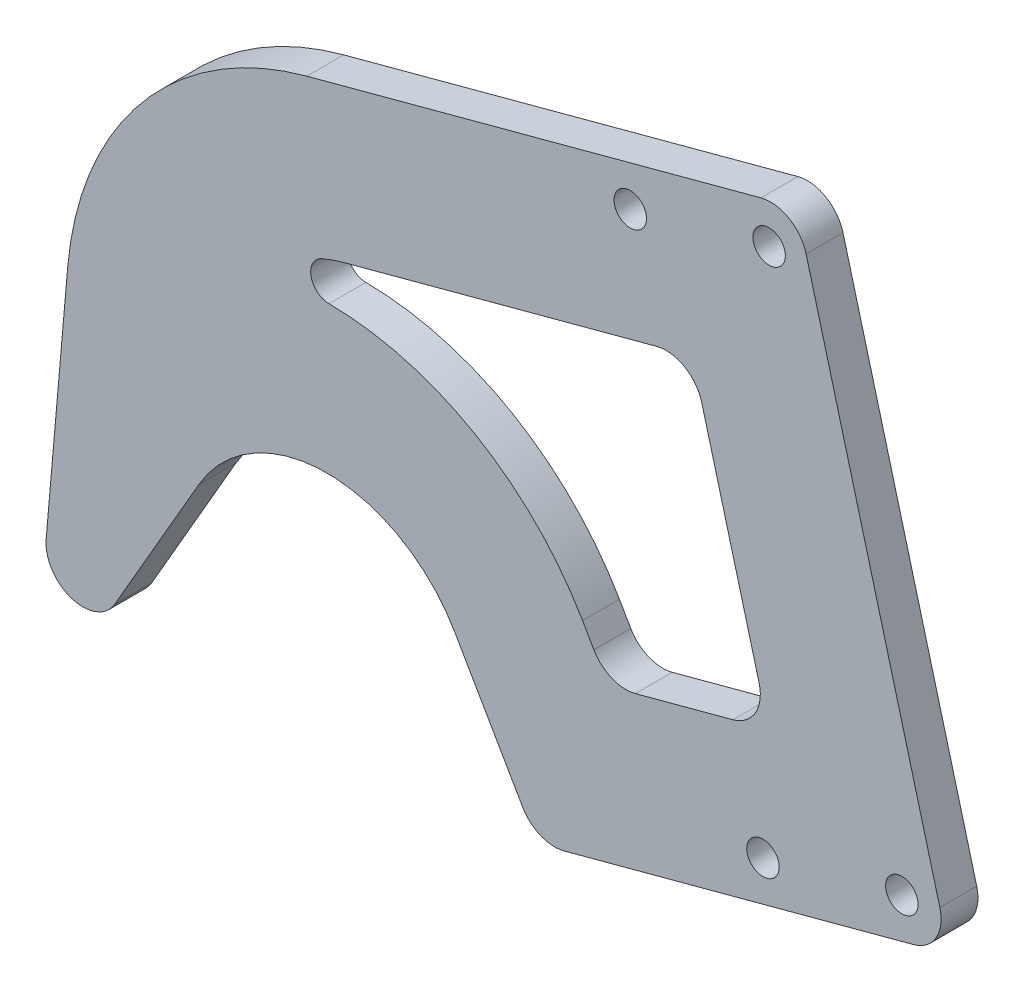
ISO-10303-21;
HEADER;
FILE_DESCRIPTION(('STEP AP214'),'2;1');
FILE_NAME('part.step','',(''),(''),'','','');
FILE_SCHEMA(('AUTOMOTIVE_DESIGN { 1 0 10303 214 1 1 1 1 }'));
ENDSEC;
DATA;
#1=APPLICATION_CONTEXT('core data for automotive mechanical design processes');
#2=APPLICATION_PROTOCOL_DEFINITION('international standard','automotive_design',2000,#1);
#3=PRODUCT_CONTEXT('',#1,'mechanical');
#4=PRODUCT('Part','Part','',(#3));
#5=PRODUCT_RELATED_PRODUCT_CATEGORY('part','',(#4));
#6=PRODUCT_DEFINITION_FORMATION('','',#4);
#7=PRODUCT_DEFINITION_CONTEXT('part definition',#1,'design');
#8=PRODUCT_DEFINITION('design','',#6,#7);
#9=PRODUCT_DEFINITION_SHAPE('','',#8);
#10=(LENGTH_UNIT() NAMED_UNIT(*) SI_UNIT(.MILLI.,.METRE.));
#11=(NAMED_UNIT(*) PLANE_ANGLE_UNIT() SI_UNIT($,.RADIAN.));
#12=(NAMED_UNIT(*) SI_UNIT($,.STERADIAN.) SOLID_ANGLE_UNIT());
#13=UNCERTAINTY_MEASURE_WITH_UNIT(LENGTH_MEASURE(1.E-05),#10,'distance_accuracy_value','');
#14=(GEOMETRIC_REPRESENTATION_CONTEXT(3) GLOBAL_UNCERTAINTY_ASSIGNED_CONTEXT((#13)) GLOBAL_UNIT_ASSIGNED_CONTEXT((#10,
#11,#12)) REPRESENTATION_CONTEXT('',''));
#15=CARTESIAN_POINT('',(0.,0.,0.));
#16=DIRECTION('',(0.,0.,1.));
#17=DIRECTION('',(1.,0.,0.));
#18=AXIS2_PLACEMENT_3D('',#15,#16,#17);
#19=CARTESIAN_POINT('',(0.,17.3058666666666,-1.5875));
#20=DIRECTION('',(0.,0.,1.));
#21=DIRECTION('',(-1.,0.,0.));
#22=AXIS2_PLACEMENT_3D('',#19,#20,#21);
#23=CYLINDRICAL_SURFACE('',#22,12.7);
#24=CARTESIAN_POINT('',(0.,17.3058666666666,1.5875));
#25=DIRECTION('',(0.,0.,-1.));
#26=DIRECTION('',(-1.,0.,0.));
#27=AXIS2_PLACEMENT_3D('',#24,#25,#26);
#28=CIRCLE('',#27,12.7);
#29=CARTESIAN_POINT('',(-10.9985226280624,23.6558666666666,1.5875));
#30=VERTEX_POINT('',#29);
#31=CARTESIAN_POINT('',(10.9985226280624,23.6558666666666,1.5875));
#32=VERTEX_POINT('',#31);
#33=EDGE_CURVE('E282',#30,#32,#28,.T.);
#34=ORIENTED_EDGE('',*,*,#33,.F.);
#35=DIRECTION('',(0.,0.,1.));
#36=VECTOR('',#35,1.);
#37=CARTESIAN_POINT('',(-10.9985226280624,23.6558666666666,-1.5875));
#38=LINE('',#37,#36);
#39=CARTESIAN_POINT('',(-10.9985226280624,23.6558666666666,-1.5875));
#40=VERTEX_POINT('',#39);
#41=EDGE_CURVE('E321',#40,#30,#38,.T.);
#42=ORIENTED_EDGE('',*,*,#41,.F.);
#43=CARTESIAN_POINT('',(0.,17.3058666666666,-1.5875));
#44=DIRECTION('',(0.,0.,-1.));
#45=DIRECTION('',(-1.,0.,0.));
#46=AXIS2_PLACEMENT_3D('',#43,#44,#45);
#47=CIRCLE('',#46,12.7);
#48=CARTESIAN_POINT('',(10.9985226280624,23.6558666666666,-1.5875));
#49=VERTEX_POINT('',#48);
#50=EDGE_CURVE('E284',#40,#49,#47,.T.);
#51=ORIENTED_EDGE('',*,*,#50,.T.);
#52=DIRECTION('',(0.,0.,1.));
#53=VECTOR('',#52,1.);
#54=CARTESIAN_POINT('',(10.9985226280624,23.6558666666666,-1.5875));
#55=LINE('',#54,#53);
#56=EDGE_CURVE('E379',#49,#32,#55,.T.);
#57=ORIENTED_EDGE('',*,*,#56,.T.);
#58=EDGE_LOOP('',(#34,#42,#51,#57));
#59=FACE_BOUND('',#58,.T.);
#60=ADVANCED_FACE('F49',(#59),#23,.F.);
#61=CARTESIAN_POINT('',(10.9985226280624,23.6558666666666,-1.5875));
#62=DIRECTION('',(0.866025403784439,0.499999999999999,0.));
#63=DIRECTION('',(-0.499999999999999,0.86602540378444,0.));
#64=AXIS2_PLACEMENT_3D('',#61,#62,#63);
#65=PLANE('',#64);
#66=DIRECTION('',(0.499999999999999,-0.866025403784439,0.));
#67=VECTOR('',#66,1.);
#68=CARTESIAN_POINT('',(10.9985226280624,23.6558666666666,1.5875));
#69=LINE('',#68,#67);
#70=CARTESIAN_POINT('',(16.8477998671147,13.5246213010718,1.5875));
#71=VERTEX_POINT('',#70);
#72=EDGE_CURVE('E325',#32,#71,#69,.T.);
#73=ORIENTED_EDGE('',*,*,#72,.F.);
#74=ORIENTED_EDGE('',*,*,#56,.F.);
#75=DIRECTION('',(0.499999999999999,-0.866025403784439,0.));
#76=VECTOR('',#75,1.);
#77=CARTESIAN_POINT('',(10.9985226280624,23.6558666666666,-1.5875));
#78=LINE('',#77,#76);
#79=CARTESIAN_POINT('',(16.8477998671147,13.5246213010718,-1.5875));
#80=VERTEX_POINT('',#79);
#81=EDGE_CURVE('E288',#49,#80,#78,.T.);
#82=ORIENTED_EDGE('',*,*,#81,.T.);
#83=DIRECTION('',(0.,0.,1.));
#84=VECTOR('',#83,1.);
#85=CARTESIAN_POINT('',(16.8477998671147,13.5246213010718,-1.5875));
#86=LINE('',#85,#84);
#87=EDGE_CURVE('E376',#80,#71,#86,.T.);
#88=ORIENTED_EDGE('',*,*,#87,.T.);
#89=EDGE_LOOP('',(#73,#74,#82,#88));
#90=FACE_BOUND('',#89,.T.);
#91=ADVANCED_FACE('F485',(#90),#65,.F.);
#92=CARTESIAN_POINT('',(19.5974305241302,15.1121213010718,-1.5875));
#93=DIRECTION('',(0.,0.,1.));
#94=DIRECTION('',(-1.,0.,0.));
#95=AXIS2_PLACEMENT_3D('',#92,#93,#94);
#96=CYLINDRICAL_SURFACE('',#95,3.175);
#97=CARTESIAN_POINT('',(19.5974305241302,15.1121213010718,1.5875));
#98=DIRECTION('',(0.,0.,1.));
#99=DIRECTION('',(1.,0.,0.));
#100=AXIS2_PLACEMENT_3D('',#97,#98,#99);
#101=CIRCLE('',#100,3.175);
#102=CARTESIAN_POINT('',(20.4191809923307,12.045306802604,1.5875));
#103=VERTEX_POINT('',#102);
#104=EDGE_CURVE('E329',#71,#103,#101,.T.);
#105=ORIENTED_EDGE('',*,*,#104,.F.);
#106=ORIENTED_EDGE('',*,*,#87,.F.);
#107=CARTESIAN_POINT('',(19.5974305241302,15.1121213010718,-1.5875));
#108=DIRECTION('',(0.,0.,1.));
#109=DIRECTION('',(1.,0.,0.));
#110=AXIS2_PLACEMENT_3D('',#107,#108,#109);
#111=CIRCLE('',#110,3.175);
#112=CARTESIAN_POINT('',(20.4191809923307,12.045306802604,-1.5875));
#113=VERTEX_POINT('',#112);
#114=EDGE_CURVE('E293',#80,#113,#111,.T.);
#115=ORIENTED_EDGE('',*,*,#114,.T.);
#116=DIRECTION('',(0.,0.,1.));
#117=VECTOR('',#116,1.);
#118=CARTESIAN_POINT('',(20.4191809923307,12.045306802604,-1.5875));
#119=LINE('',#118,#117);
#120=EDGE_CURVE('E373',#113,#103,#119,.T.);
#121=ORIENTED_EDGE('',*,*,#120,.T.);
#122=EDGE_LOOP('',(#105,#106,#115,#121));
#123=FACE_BOUND('',#122,.T.);
#124=ADVANCED_FACE('F491',(#123),#96,.T.);
#125=CARTESIAN_POINT('',(20.4191809923308,12.045306802604,-1.5875));
#126=DIRECTION('',(-0.258819045102522,0.965925826289068,0.));
#127=DIRECTION('',(-0.965925826289068,-0.258819045102522,0.));
#128=AXIS2_PLACEMENT_3D('',#125,#126,#127);
#129=PLANE('',#128);
#130=DIRECTION('',(0.965925826289068,0.258819045102522,0.));
#131=VECTOR('',#130,1.);
#132=CARTESIAN_POINT('',(20.4191809923308,12.045306802604,1.5875));
#133=LINE('',#132,#131);
#134=CARTESIAN_POINT('',(50.4923455375514,20.1033869563442,1.5875));
#135=VERTEX_POINT('',#134);
#136=EDGE_CURVE('E332',#103,#135,#133,.T.);
#137=ORIENTED_EDGE('',*,*,#136,.F.);
#138=ORIENTED_EDGE('',*,*,#120,.F.);
#139=DIRECTION('',(0.965925826289068,0.258819045102522,0.));
#140=VECTOR('',#139,1.);
#141=CARTESIAN_POINT('',(20.4191809923308,12.045306802604,-1.5875));
#142=LINE('',#141,#140);
#143=CARTESIAN_POINT('',(50.4923455375514,20.1033869563442,-1.5875));
#144=VERTEX_POINT('',#143);
#145=EDGE_CURVE('E296',#113,#144,#142,.T.);
#146=ORIENTED_EDGE('',*,*,#145,.T.);
#147=DIRECTION('',(0.,0.,1.));
#148=VECTOR('',#147,1.);
#149=CARTESIAN_POINT('',(50.4923455375514,20.1033869563442,-1.5875));
#150=LINE('',#149,#148);
#151=EDGE_CURVE('E395',#135,#144,#150,.F.);
#152=ORIENTED_EDGE('',*,*,#151,.F.);
#153=EDGE_LOOP('',(#137,#138,#146,#152));
#154=FACE_BOUND('',#153,.T.);
#155=ADVANCED_FACE('F709',(#154),#129,.F.);
#156=CARTESIAN_POINT('',(53.5591600360192,20.9251374245447,-1.5875));
#157=DIRECTION('',(-0.965925826289068,-0.258819045102521,0.));
#158=DIRECTION('',(0.258819045102521,-0.965925826289068,0.));
#159=AXIS2_PLACEMENT_3D('',#156,#157,#158);
#160=PLANE('',#159);
#161=DIRECTION('',(-0.258819045102521,0.965925826289068,0.));
#162=VECTOR('',#161,1.);
#163=CARTESIAN_POINT('',(53.5591600360192,20.9251374245447,-1.5875));
#164=LINE('',#163,#162);
#165=CARTESIAN_POINT('',(52.7374095678187,23.9919519230125,-1.5875));
#166=VERTEX_POINT('',#165);
#167=CARTESIAN_POINT('',(41.2329030130117,66.9273549015616,-1.5875));
#168=VERTEX_POINT('',#167);
#169=EDGE_CURVE('E299',#166,#168,#164,.T.);
#170=ORIENTED_EDGE('',*,*,#169,.T.);
#171=DIRECTION('',(0.,0.,1.));
#172=VECTOR('',#171,1.);
#173=CARTESIAN_POINT('',(41.2329030130116,66.9273549015616,-1.5875));
#174=LINE('',#173,#172);
#175=CARTESIAN_POINT('',(41.2329030130117,66.9273549015616,1.5875));
#176=VERTEX_POINT('',#175);
#177=EDGE_CURVE('E383',#176,#168,#174,.F.);
#178=ORIENTED_EDGE('',*,*,#177,.F.);
#179=DIRECTION('',(-0.258819045102521,0.965925826289068,0.));
#180=VECTOR('',#179,1.);
#181=CARTESIAN_POINT('',(53.5591600360192,20.9251374245447,1.5875));
#182=LINE('',#181,#180);
#183=CARTESIAN_POINT('',(52.7374095678187,23.9919519230125,1.5875));
#184=VERTEX_POINT('',#183);
#185=EDGE_CURVE('E335',#184,#176,#182,.T.);
#186=ORIENTED_EDGE('',*,*,#185,.F.);
#187=DIRECTION('',(0.,0.,1.));
#188=VECTOR('',#187,1.);
#189=CARTESIAN_POINT('',(52.7374095678187,23.9919519230125,-1.5875));
#190=LINE('',#189,#188);
#191=EDGE_CURVE('E387',#166,#184,#190,.T.);
#192=ORIENTED_EDGE('',*,*,#191,.F.);
#193=EDGE_LOOP('',(#170,#178,#186,#192));
#194=FACE_BOUND('',#193,.T.);
#195=ADVANCED_FACE('F698',(#194),#160,.F.);
#196=CARTESIAN_POINT('',(-1.72065451339829,58.7049857231183,-1.5875));
#197=DIRECTION('',(0.258819045102522,-0.965925826289068,0.));
#198=DIRECTION('',(0.965925826289068,0.258819045102522,0.));
#199=AXIS2_PLACEMENT_3D('',#196,#197,#198);
#200=PLANE('',#199);
#201=DIRECTION('',(-0.965925826289068,-0.258819045102522,0.));
#202=VECTOR('',#201,1.);
#203=CARTESIAN_POINT('',(-1.72065451339829,58.7049857231183,-1.5875));
#204=LINE('',#203,#202);
#205=CARTESIAN_POINT('',(37.3443380463433,69.1724189318289,-1.5875));
#206=VERTEX_POINT('',#205);
#207=CARTESIAN_POINT('',(-1.72065451339829,58.7049857231183,-1.5875));
#208=VERTEX_POINT('',#207);
#209=EDGE_CURVE('E303',#206,#208,#204,.T.);
#210=ORIENTED_EDGE('',*,*,#209,.T.);
#211=DIRECTION('',(0.,0.,1.));
#212=VECTOR('',#211,1.);
#213=CARTESIAN_POINT('',(-1.72065451339829,58.7049857231183,-1.5875));
#214=LINE('',#213,#212);
#215=CARTESIAN_POINT('',(-1.72065451339829,58.7049857231183,1.5875));
#216=VERTEX_POINT('',#215);
#217=EDGE_CURVE('E369',#208,#216,#214,.T.);
#218=ORIENTED_EDGE('',*,*,#217,.T.);
#219=DIRECTION('',(-0.965925826289068,-0.258819045102522,0.));
#220=VECTOR('',#219,1.);
#221=CARTESIAN_POINT('',(-1.72065451339829,58.7049857231183,1.5875));
#222=LINE('',#221,#220);
#223=CARTESIAN_POINT('',(37.3443380463433,69.1724189318289,1.5875));
#224=VERTEX_POINT('',#223);
#225=EDGE_CURVE('E339',#224,#216,#222,.T.);
#226=ORIENTED_EDGE('',*,*,#225,.F.);
#227=DIRECTION('',(0.,0.,1.));
#228=VECTOR('',#227,1.);
#229=CARTESIAN_POINT('',(37.3443380463433,69.1724189318289,-1.5875));
#230=LINE('',#229,#228);
#231=EDGE_CURVE('E403',#206,#224,#230,.T.);
#232=ORIENTED_EDGE('',*,*,#231,.F.);
#233=EDGE_LOOP('',(#210,#218,#226,#232));
#234=FACE_BOUND('',#233,.T.);
#235=ADVANCED_FACE('F688',(#234),#200,.F.);
#236=CARTESIAN_POINT('',(5.50191214310372,31.75,-1.5875));
#237=DIRECTION('',(0.,0.,1.));
#238=DIRECTION('',(-1.,0.,0.));
#239=AXIS2_PLACEMENT_3D('',#236,#237,#238);
#240=CYLINDRICAL_SURFACE('',#239,27.9058546624382);
#241=CARTESIAN_POINT('',(5.50191214310372,31.75,1.5875));
#242=DIRECTION('',(0.,0.,1.));
#243=DIRECTION('',(1.,0.,0.));
#244=AXIS2_PLACEMENT_3D('',#241,#242,#243);
#245=CIRCLE('',#244,27.9058546624382);
#246=CARTESIAN_POINT('',(-22.297752317336,34.1821554901132,1.5875));
#247=VERTEX_POINT('',#246);
#248=EDGE_CURVE('E343',#216,#247,#245,.T.);
#249=ORIENTED_EDGE('',*,*,#248,.F.);
#250=ORIENTED_EDGE('',*,*,#217,.F.);
#251=CARTESIAN_POINT('',(5.50191214310372,31.75,-1.5875));
#252=DIRECTION('',(0.,0.,1.));
#253=DIRECTION('',(1.,0.,0.));
#254=AXIS2_PLACEMENT_3D('',#251,#252,#253);
#255=CIRCLE('',#254,27.9058546624382);
#256=CARTESIAN_POINT('',(-22.297752317336,34.1821554901132,-1.5875));
#257=VERTEX_POINT('',#256);
#258=EDGE_CURVE('E307',#208,#257,#255,.T.);
#259=ORIENTED_EDGE('',*,*,#258,.T.);
#260=DIRECTION('',(0.,0.,1.));
#261=VECTOR('',#260,1.);
#262=CARTESIAN_POINT('',(-22.297752317336,34.1821554901132,-1.5875));
#263=LINE('',#262,#261);
#264=EDGE_CURVE('E365',#257,#247,#263,.T.);
#265=ORIENTED_EDGE('',*,*,#264,.T.);
#266=EDGE_LOOP('',(#249,#250,#259,#265));
#267=FACE_BOUND('',#266,.T.);
#268=ADVANCED_FACE('F678',(#267),#240,.T.);
#269=CARTESIAN_POINT('',(-24.1529875730634,12.9767194832238,-1.5875));
#270=DIRECTION('',(0.996194698091745,-0.0871557427476642,0.));
#271=DIRECTION('',(0.0871557427476642,0.996194698091745,0.));
#272=AXIS2_PLACEMENT_3D('',#269,#270,#271);
#273=PLANE('',#272);
#274=DIRECTION('',(-0.0871557427476642,-0.996194698091745,0.));
#275=VECTOR('',#274,1.);
#276=CARTESIAN_POINT('',(-24.1529875730634,12.9767194832238,1.5875));
#277=LINE('',#276,#275);
#278=CARTESIAN_POINT('',(-24.1529875730634,12.9767194832238,1.5875));
#279=VERTEX_POINT('',#278);
#280=EDGE_CURVE('E347',#247,#279,#277,.T.);
#281=ORIENTED_EDGE('',*,*,#280,.F.);
#282=ORIENTED_EDGE('',*,*,#264,.F.);
#283=DIRECTION('',(-0.0871557427476642,-0.996194698091745,0.));
#284=VECTOR('',#283,1.);
#285=CARTESIAN_POINT('',(-24.1529875730634,12.9767194832238,-1.5875));
#286=LINE('',#285,#284);
#287=CARTESIAN_POINT('',(-24.1529875730634,12.9767194832238,-1.5875));
#288=VERTEX_POINT('',#287);
#289=EDGE_CURVE('E311',#257,#288,#286,.T.);
#290=ORIENTED_EDGE('',*,*,#289,.T.);
#291=DIRECTION('',(0.,0.,1.));
#292=VECTOR('',#291,1.);
#293=CARTESIAN_POINT('',(-24.1529875730634,12.9767194832238,-1.5875));
#294=LINE('',#293,#292);
#295=EDGE_CURVE('E362',#288,#279,#294,.T.);
#296=ORIENTED_EDGE('',*,*,#295,.T.);
#297=EDGE_LOOP('',(#281,#282,#290,#296));
#298=FACE_BOUND('',#297,.T.);
#299=ADVANCED_FACE('F668',(#298),#273,.F.);
#300=CARTESIAN_POINT('',(-20.9900694066221,12.7,-1.5875));
#301=DIRECTION('',(0.,0.,1.));
#302=DIRECTION('',(-1.,0.,0.));
#303=AXIS2_PLACEMENT_3D('',#300,#301,#302);
#304=CYLINDRICAL_SURFACE('',#303,3.175);
#305=CARTESIAN_POINT('',(-20.9900694066221,12.7,1.5875));
#306=DIRECTION('',(0.,0.,1.));
#307=DIRECTION('',(1.,0.,0.));
#308=AXIS2_PLACEMENT_3D('',#305,#306,#307);
#309=CIRCLE('',#308,3.175);
#310=CARTESIAN_POINT('',(-18.2404387496065,11.1125,1.5875));
#311=VERTEX_POINT('',#310);
#312=EDGE_CURVE('E351',#279,#311,#309,.T.);
#313=ORIENTED_EDGE('',*,*,#312,.F.);
#314=ORIENTED_EDGE('',*,*,#295,.F.);
#315=CARTESIAN_POINT('',(-20.9900694066221,12.7,-1.5875));
#316=DIRECTION('',(0.,0.,1.));
#317=DIRECTION('',(1.,0.,0.));
#318=AXIS2_PLACEMENT_3D('',#315,#316,#317);
#319=CIRCLE('',#318,3.175);
#320=CARTESIAN_POINT('',(-18.2404387496065,11.1125,-1.5875));
#321=VERTEX_POINT('',#320);
#322=EDGE_CURVE('E315',#288,#321,#319,.T.);
#323=ORIENTED_EDGE('',*,*,#322,.T.);
#324=DIRECTION('',(0.,0.,1.));
#325=VECTOR('',#324,1.);
#326=CARTESIAN_POINT('',(-18.2404387496065,11.1125,-1.5875));
#327=LINE('',#326,#325);
#328=EDGE_CURVE('E359',#321,#311,#327,.T.);
#329=ORIENTED_EDGE('',*,*,#328,.T.);
#330=EDGE_LOOP('',(#313,#314,#323,#329));
#331=FACE_BOUND('',#330,.T.);
#332=ADVANCED_FACE('F658',(#331),#304,.T.);
#333=CARTESIAN_POINT('',(-10.9985226280624,23.6558666666666,-1.5875));
#334=DIRECTION('',(-0.866025403784439,0.5,0.));
#335=DIRECTION('',(-0.5,-0.866025403784439,0.));
#336=AXIS2_PLACEMENT_3D('',#333,#334,#335);
#337=PLANE('',#336);
#338=DIRECTION('',(0.5,0.866025403784439,0.));
#339=VECTOR('',#338,1.);
#340=CARTESIAN_POINT('',(-10.9985226280624,23.6558666666666,1.5875));
#341=LINE('',#340,#339);
#342=EDGE_CURVE('E289',#311,#30,#341,.T.);
#343=ORIENTED_EDGE('',*,*,#342,.F.);
#344=ORIENTED_EDGE('',*,*,#328,.F.);
#345=DIRECTION('',(0.5,0.866025403784439,0.));
#346=VECTOR('',#345,1.);
#347=CARTESIAN_POINT('',(-10.9985226280624,23.6558666666666,-1.5875));
#348=LINE('',#347,#346);
#349=EDGE_CURVE('E318',#321,#40,#348,.T.);
#350=ORIENTED_EDGE('',*,*,#349,.T.);
#351=ORIENTED_EDGE('',*,*,#41,.T.);
#352=EDGE_LOOP('',(#343,#344,#350,#351));
#353=FACE_BOUND('',#352,.T.);
#354=ADVANCED_FACE('F648',(#353),#337,.F.);
#355=CARTESIAN_POINT('',(0.,17.3058666666666,-1.5875));
#356=DIRECTION('',(0.,0.,1.));
#357=DIRECTION('',(-1.,0.,0.));
#358=AXIS2_PLACEMENT_3D('',#355,#356,#357);
#359=PLANE('',#358);
#360=CARTESIAN_POINT('',(37.5200804050536,20.0854049602765,-1.5875));
#361=DIRECTION('',(0.,0.,-1.));
#362=DIRECTION('',(-1.,0.,0.));
#363=AXIS2_PLACEMENT_3D('',#360,#361,#362);
#364=CIRCLE('',#363,1.39699999999982);
#365=CARTESIAN_POINT('',(36.1230804050538,20.0854049602765,-1.5875));
#366=VERTEX_POINT('',#365);
#367=EDGE_CURVE('E267',#366,#366,#364,.T.);
#368=ORIENTED_EDGE('',*,*,#367,.F.);
#369=EDGE_LOOP('',(#368));
#370=FACE_BOUND('',#369,.T.);
#371=CARTESIAN_POINT('',(26.1010358989393,62.701859230985,-1.5875));
#372=DIRECTION('',(0.,0.,-1.));
#373=DIRECTION('',(-1.,0.,0.));
#374=AXIS2_PLACEMENT_3D('',#371,#372,#373);
#375=CIRCLE('',#374,1.39699999999982);
#376=CARTESIAN_POINT('',(24.7040358989395,62.701859230985,-1.5875));
#377=VERTEX_POINT('',#376);
#378=EDGE_CURVE('E760',#377,#377,#375,.T.);
#379=ORIENTED_EDGE('',*,*,#378,.F.);
#380=EDGE_LOOP('',(#379));
#381=FACE_BOUND('',#380,.T.);
#382=CARTESIAN_POINT('',(38.0493451849699,65.9033990550941,-1.5875));
#383=DIRECTION('',(0.,0.,-1.));
#384=DIRECTION('',(-1.,0.,0.));
#385=AXIS2_PLACEMENT_3D('',#382,#383,#384);
#386=CIRCLE('',#385,1.39699999999981);
#387=CARTESIAN_POINT('',(36.6523451849701,65.9033990550941,-1.5875));
#388=VERTEX_POINT('',#387);
#389=EDGE_CURVE('E764',#388,#388,#386,.T.);
#390=ORIENTED_EDGE('',*,*,#389,.F.);
#391=EDGE_LOOP('',(#390));
#392=FACE_BOUND('',#391,.T.);
#393=CARTESIAN_POINT('',(49.4683896910841,23.2869447843857,-1.5875));
#394=DIRECTION('',(0.,0.,-1.));
#395=DIRECTION('',(-1.,0.,0.));
#396=AXIS2_PLACEMENT_3D('',#393,#394,#395);
#397=CIRCLE('',#396,1.39699999999982);
#398=CARTESIAN_POINT('',(48.0713896910843,23.2869447843857,-1.5875));
#399=VERTEX_POINT('',#398);
#400=EDGE_CURVE('E767',#399,#399,#397,.T.);
#401=ORIENTED_EDGE('',*,*,#400,.F.);
#402=EDGE_LOOP('',(#401));
#403=FACE_BOUND('',#402,.T.);
#404=CARTESIAN_POINT('',(5.50191214310372,31.75,-1.5875));
#405=DIRECTION('',(0.,0.,1.));
#406=DIRECTION('',(1.,0.,0.));
#407=AXIS2_PLACEMENT_3D('',#404,#405,#406);
#408=CIRCLE('',#407,15.2058546624382);
#409=CARTESIAN_POINT('',(1.56634735940374,46.4377277292471,-1.5875));
#410=VERTEX_POINT('',#409);
#411=CARTESIAN_POINT('',(-0.421343194027553,45.7547514160852,-1.5875));
#412=VERTEX_POINT('',#411);
#413=EDGE_CURVE('E224',#410,#412,#408,.T.);
#414=ORIENTED_EDGE('',*,*,#413,.T.);
#415=CARTESIAN_POINT('',(0.197048080678221,44.2926472879986,-1.5875));
#416=DIRECTION('',(0.,0.,-1.));
#417=DIRECTION('',(-1.,0.,0.));
#418=AXIS2_PLACEMENT_3D('',#415,#416,#417);
#419=CIRCLE('',#418,1.5875);
#420=CARTESIAN_POINT('',(0.185457017108914,42.7051896043908,-1.5875));
#421=VERTEX_POINT('',#420);
#422=EDGE_CURVE('E58',#421,#412,#419,.T.);
#423=ORIENTED_EDGE('',*,*,#422,.F.);
#424=CARTESIAN_POINT('',(0.,17.3058666666666,-1.5875));
#425=DIRECTION('',(0.,0.,-1.));
#426=DIRECTION('',(1.,0.,0.));
#427=AXIS2_PLACEMENT_3D('',#424,#425,#426);
#428=CIRCLE('',#427,25.4);
#429=CARTESIAN_POINT('',(21.9970452561247,30.0058666666666,-1.5875));
#430=VERTEX_POINT('',#429);
#431=EDGE_CURVE('E269',#421,#430,#428,.T.);
#432=ORIENTED_EDGE('',*,*,#431,.T.);
#433=DIRECTION('',(0.499999999999998,-0.866025403784439,0.));
#434=VECTOR('',#433,1.);
#435=CARTESIAN_POINT('',(21.9970452561247,30.0058666666666,-1.5875));
#436=LINE('',#435,#434);
#437=CARTESIAN_POINT('',(22.9737961215106,28.3140845414814,-1.5875));
#438=VERTEX_POINT('',#437);
#439=EDGE_CURVE('E273',#430,#438,#436,.T.);
#440=ORIENTED_EDGE('',*,*,#439,.T.);
#441=CARTESIAN_POINT('',(25.7234267785262,29.9015845414814,-1.5875));
#442=DIRECTION('',(0.,0.,-1.));
#443=DIRECTION('',(-1.,0.,0.));
#444=AXIS2_PLACEMENT_3D('',#441,#442,#443);
#445=CIRCLE('',#444,3.175);
#446=CARTESIAN_POINT('',(26.5451772467267,26.8347700430136,-1.5875));
#447=VERTEX_POINT('',#446);
#448=EDGE_CURVE('E435',#447,#438,#445,.T.);
#449=ORIENTED_EDGE('',*,*,#448,.F.);
#450=DIRECTION('',(0.965925826289068,0.258819045102521,0.));
#451=VECTOR('',#450,1.);
#452=CARTESIAN_POINT('',(24.1919277149272,26.204218731379,-1.5875));
#453=LINE('',#452,#451);
#454=CARTESIAN_POINT('',(34.9380856708783,29.0836430774133,-1.5875));
#455=VERTEX_POINT('',#454);
#456=EDGE_CURVE('E276',#447,#455,#453,.T.);
#457=ORIENTED_EDGE('',*,*,#456,.T.);
#458=CARTESIAN_POINT('',(34.1163352026777,32.1504575758811,-1.5875));
#459=DIRECTION('',(0.,0.,-1.));
#460=DIRECTION('',(-1.,0.,0.));
#461=AXIS2_PLACEMENT_3D('',#458,#459,#460);
#462=CIRCLE('',#461,3.175);
#463=CARTESIAN_POINT('',(37.1831497011455,32.9722080440816,-1.5875));
#464=VERTEX_POINT('',#463);
#465=EDGE_CURVE('E428',#464,#455,#462,.T.);
#466=ORIENTED_EDGE('',*,*,#465,.F.);
#467=DIRECTION('',(-0.258819045102521,0.965925826289068,0.));
#468=VECTOR('',#467,1.);
#469=CARTESIAN_POINT('',(38.004900169346,29.9053935456138,-1.5875));
#470=LINE('',#469,#468);
#471=CARTESIAN_POINT('',(32.2526468919425,51.3730950348884,-1.5875));
#472=VERTEX_POINT('',#471);
#473=EDGE_CURVE('E240',#464,#472,#470,.T.);
#474=ORIENTED_EDGE('',*,*,#473,.T.);
#475=CARTESIAN_POINT('',(29.1858323934747,50.5513445666879,-1.5875));
#476=DIRECTION('',(0.,0.,-1.));
#477=DIRECTION('',(-1.,0.,0.));
#478=AXIS2_PLACEMENT_3D('',#475,#476,#477);
#479=CIRCLE('',#478,3.175);
#480=CARTESIAN_POINT('',(28.3640819252742,53.6181590651557,-1.5875));
#481=VERTEX_POINT('',#480);
#482=EDGE_CURVE('E421',#481,#472,#479,.T.);
#483=ORIENTED_EDGE('',*,*,#482,.F.);
#484=DIRECTION('',(-0.965925826289068,-0.258819045102522,0.));
#485=VECTOR('',#484,1.);
#486=CARTESIAN_POINT('',(31.430896423742,54.4399095333562,-1.5875));
#487=LINE('',#486,#485);
#488=EDGE_CURVE('E264',#481,#410,#487,.T.);
#489=ORIENTED_EDGE('',*,*,#488,.T.);
#490=EDGE_LOOP('',(#414,#423,#432,#440,#449,#457,#466,#474,#483,#489));
#491=FACE_BOUND('',#490,.T.);
#492=ORIENTED_EDGE('',*,*,#145,.F.);
#493=ORIENTED_EDGE('',*,*,#114,.F.);
#494=ORIENTED_EDGE('',*,*,#81,.F.);
#495=ORIENTED_EDGE('',*,*,#50,.F.);
#496=ORIENTED_EDGE('',*,*,#349,.F.);
#497=ORIENTED_EDGE('',*,*,#322,.F.);
#498=ORIENTED_EDGE('',*,*,#289,.F.);
#499=ORIENTED_EDGE('',*,*,#258,.F.);
#500=ORIENTED_EDGE('',*,*,#209,.F.);
#501=CARTESIAN_POINT('',(38.1660885145438,66.1056044333611,-1.5875));
#502=DIRECTION('',(0.,0.,-1.));
#503=DIRECTION('',(-1.,0.,0.));
#504=AXIS2_PLACEMENT_3D('',#501,#502,#503);
#505=CIRCLE('',#504,3.175);
#506=EDGE_CURVE('E398',#168,#206,#505,.F.);
#507=ORIENTED_EDGE('',*,*,#506,.F.);
#508=ORIENTED_EDGE('',*,*,#169,.F.);
#509=CARTESIAN_POINT('',(49.6705950693509,23.170201454812,-1.5875));
#510=DIRECTION('',(0.,0.,-1.));
#511=DIRECTION('',(-1.,0.,0.));
#512=AXIS2_PLACEMENT_3D('',#509,#510,#511);
#513=CIRCLE('',#512,3.175);
#514=EDGE_CURVE('E401',#144,#166,#513,.F.);
#515=ORIENTED_EDGE('',*,*,#514,.F.);
#516=EDGE_LOOP('',(#492,#493,#494,#495,#496,#497,#498,#499,#500,#507,#508,#515));
#517=FACE_BOUND('',#516,.T.);
#518=ADVANCED_FACE('F449',(#370,#381,#392,#403,#491,#517),#359,.F.);
#519=CARTESIAN_POINT('',(0.,17.3058666666666,1.5875));
#520=DIRECTION('',(0.,0.,1.));
#521=DIRECTION('',(-1.,0.,0.));
#522=AXIS2_PLACEMENT_3D('',#519,#520,#521);
#523=PLANE('',#522);
#524=CARTESIAN_POINT('',(37.5200804050536,20.0854049602765,1.5875));
#525=DIRECTION('',(0.,0.,-1.));
#526=DIRECTION('',(-1.,0.,0.));
#527=AXIS2_PLACEMENT_3D('',#524,#525,#526);
#528=CIRCLE('',#527,1.39699999999982);
#529=CARTESIAN_POINT('',(36.1230804050538,20.0854049602765,1.5875));
#530=VERTEX_POINT('',#529);
#531=EDGE_CURVE('E784',#530,#530,#528,.T.);
#532=ORIENTED_EDGE('',*,*,#531,.T.);
#533=EDGE_LOOP('',(#532));
#534=FACE_BOUND('',#533,.T.);
#535=CARTESIAN_POINT('',(26.1010358989393,62.701859230985,1.5875));
#536=DIRECTION('',(0.,0.,-1.));
#537=DIRECTION('',(-1.,0.,0.));
#538=AXIS2_PLACEMENT_3D('',#535,#536,#537);
#539=CIRCLE('',#538,1.39699999999982);
#540=CARTESIAN_POINT('',(24.7040358989395,62.701859230985,1.5875));
#541=VERTEX_POINT('',#540);
#542=EDGE_CURVE('E780',#541,#541,#539,.T.);
#543=ORIENTED_EDGE('',*,*,#542,.T.);
#544=EDGE_LOOP('',(#543));
#545=FACE_BOUND('',#544,.T.);
#546=CARTESIAN_POINT('',(38.0493451849699,65.9033990550941,1.5875));
#547=DIRECTION('',(0.,0.,-1.));
#548=DIRECTION('',(-1.,0.,0.));
#549=AXIS2_PLACEMENT_3D('',#546,#547,#548);
#550=CIRCLE('',#549,1.39699999999981);
#551=CARTESIAN_POINT('',(36.6523451849701,65.9033990550941,1.5875));
#552=VERTEX_POINT('',#551);
#553=EDGE_CURVE('E774',#552,#552,#550,.T.);
#554=ORIENTED_EDGE('',*,*,#553,.T.);
#555=EDGE_LOOP('',(#554));
#556=FACE_BOUND('',#555,.T.);
#557=CARTESIAN_POINT('',(49.4683896910841,23.2869447843857,1.5875));
#558=DIRECTION('',(0.,0.,-1.));
#559=DIRECTION('',(-1.,0.,0.));
#560=AXIS2_PLACEMENT_3D('',#557,#558,#559);
#561=CIRCLE('',#560,1.39699999999982);
#562=CARTESIAN_POINT('',(48.0713896910843,23.2869447843857,1.5875));
#563=VERTEX_POINT('',#562);
#564=EDGE_CURVE('E768',#563,#563,#561,.T.);
#565=ORIENTED_EDGE('',*,*,#564,.T.);
#566=EDGE_LOOP('',(#565));
#567=FACE_BOUND('',#566,.T.);
#568=DIRECTION('',(-0.258819045102521,0.965925826289068,0.));
#569=VECTOR('',#568,1.);
#570=CARTESIAN_POINT('',(38.004900169346,29.9053935456138,1.5875));
#571=LINE('',#570,#569);
#572=CARTESIAN_POINT('',(37.1831497011455,32.9722080440816,1.5875));
#573=VERTEX_POINT('',#572);
#574=CARTESIAN_POINT('',(32.2526468919425,51.3730950348884,1.5875));
#575=VERTEX_POINT('',#574);
#576=EDGE_CURVE('E230',#573,#575,#571,.T.);
#577=ORIENTED_EDGE('',*,*,#576,.F.);
#578=CARTESIAN_POINT('',(34.1163352026777,32.1504575758811,1.5875));
#579=DIRECTION('',(0.,0.,-1.));
#580=DIRECTION('',(-1.,0.,0.));
#581=AXIS2_PLACEMENT_3D('',#578,#579,#580);
#582=CIRCLE('',#581,3.175);
#583=CARTESIAN_POINT('',(34.9380856708783,29.0836430774133,1.5875));
#584=VERTEX_POINT('',#583);
#585=EDGE_CURVE('E431',#584,#573,#582,.F.);
#586=ORIENTED_EDGE('',*,*,#585,.F.);
#587=DIRECTION('',(0.965925826289068,0.258819045102521,0.));
#588=VECTOR('',#587,1.);
#589=CARTESIAN_POINT('',(24.1919277149272,26.204218731379,1.5875));
#590=LINE('',#589,#588);
#591=CARTESIAN_POINT('',(26.5451772467267,26.8347700430136,1.5875));
#592=VERTEX_POINT('',#591);
#593=EDGE_CURVE('E258',#592,#584,#590,.T.);
#594=ORIENTED_EDGE('',*,*,#593,.F.);
#595=CARTESIAN_POINT('',(25.7234267785262,29.9015845414814,1.5875));
#596=DIRECTION('',(0.,0.,-1.));
#597=DIRECTION('',(-1.,0.,0.));
#598=AXIS2_PLACEMENT_3D('',#595,#596,#597);
#599=CIRCLE('',#598,3.175);
#600=CARTESIAN_POINT('',(22.9737961215106,28.3140845414814,1.5875));
#601=VERTEX_POINT('',#600);
#602=EDGE_CURVE('E438',#601,#592,#599,.F.);
#603=ORIENTED_EDGE('',*,*,#602,.F.);
#604=DIRECTION('',(0.499999999999998,-0.866025403784439,0.));
#605=VECTOR('',#604,1.);
#606=CARTESIAN_POINT('',(21.9970452561247,30.0058666666666,1.5875));
#607=LINE('',#606,#605);
#608=CARTESIAN_POINT('',(21.9970452561247,30.0058666666666,1.5875));
#609=VERTEX_POINT('',#608);
#610=EDGE_CURVE('E252',#609,#601,#607,.T.);
#611=ORIENTED_EDGE('',*,*,#610,.F.);
#612=CARTESIAN_POINT('',(0.,17.3058666666666,1.5875));
#613=DIRECTION('',(0.,0.,-1.));
#614=DIRECTION('',(1.,0.,0.));
#615=AXIS2_PLACEMENT_3D('',#612,#613,#614);
#616=CIRCLE('',#615,25.4);
#617=CARTESIAN_POINT('',(0.185457017108914,42.7051896043908,1.5875));
#618=VERTEX_POINT('',#617);
#619=EDGE_CURVE('E247',#618,#609,#616,.T.);
#620=ORIENTED_EDGE('',*,*,#619,.F.);
#621=CARTESIAN_POINT('',(0.197048080678221,44.2926472879986,1.5875));
#622=DIRECTION('',(0.,0.,-1.));
#623=DIRECTION('',(-1.,0.,0.));
#624=AXIS2_PLACEMENT_3D('',#621,#622,#623);
#625=CIRCLE('',#624,1.5875);
#626=CARTESIAN_POINT('',(-0.421343194027553,45.7547514160852,1.5875));
#627=VERTEX_POINT('',#626);
#628=EDGE_CURVE('E11',#627,#618,#625,.F.);
#629=ORIENTED_EDGE('',*,*,#628,.F.);
#630=CARTESIAN_POINT('',(5.50191214310372,31.75,1.5875));
#631=DIRECTION('',(0.,0.,1.));
#632=DIRECTION('',(1.,0.,0.));
#633=AXIS2_PLACEMENT_3D('',#630,#631,#632);
#634=CIRCLE('',#633,15.2058546624382);
#635=CARTESIAN_POINT('',(1.56634735940374,46.4377277292471,1.5875));
#636=VERTEX_POINT('',#635);
#637=EDGE_CURVE('E221',#636,#627,#634,.T.);
#638=ORIENTED_EDGE('',*,*,#637,.F.);
#639=DIRECTION('',(-0.965925826289068,-0.258819045102522,0.));
#640=VECTOR('',#639,1.);
#641=CARTESIAN_POINT('',(31.430896423742,54.4399095333562,1.5875));
#642=LINE('',#641,#640);
#643=CARTESIAN_POINT('',(28.3640819252742,53.6181590651557,1.5875));
#644=VERTEX_POINT('',#643);
#645=EDGE_CURVE('E233',#644,#636,#642,.T.);
#646=ORIENTED_EDGE('',*,*,#645,.F.);
#647=CARTESIAN_POINT('',(29.1858323934747,50.5513445666879,1.5875));
#648=DIRECTION('',(0.,0.,-1.));
#649=DIRECTION('',(-1.,0.,0.));
#650=AXIS2_PLACEMENT_3D('',#647,#648,#649);
#651=CIRCLE('',#650,3.175);
#652=EDGE_CURVE('E425',#575,#644,#651,.F.);
#653=ORIENTED_EDGE('',*,*,#652,.F.);
#654=EDGE_LOOP('',(#577,#586,#594,#603,#611,#620,#629,#638,#646,#653));
#655=FACE_BOUND('',#654,.T.);
#656=ORIENTED_EDGE('',*,*,#185,.T.);
#657=CARTESIAN_POINT('',(38.1660885145438,66.1056044333611,1.5875));
#658=DIRECTION('',(0.,0.,-1.));
#659=DIRECTION('',(-1.,0.,0.));
#660=AXIS2_PLACEMENT_3D('',#657,#658,#659);
#661=CIRCLE('',#660,3.175);
#662=EDGE_CURVE('E390',#224,#176,#661,.T.);
#663=ORIENTED_EDGE('',*,*,#662,.F.);
#664=ORIENTED_EDGE('',*,*,#225,.T.);
#665=ORIENTED_EDGE('',*,*,#248,.T.);
#666=ORIENTED_EDGE('',*,*,#280,.T.);
#667=ORIENTED_EDGE('',*,*,#312,.T.);
#668=ORIENTED_EDGE('',*,*,#342,.T.);
#669=ORIENTED_EDGE('',*,*,#33,.T.);
#670=ORIENTED_EDGE('',*,*,#72,.T.);
#671=ORIENTED_EDGE('',*,*,#104,.T.);
#672=ORIENTED_EDGE('',*,*,#136,.T.);
#673=CARTESIAN_POINT('',(49.6705950693509,23.170201454812,1.5875));
#674=DIRECTION('',(0.,0.,-1.));
#675=DIRECTION('',(-1.,0.,0.));
#676=AXIS2_PLACEMENT_3D('',#673,#674,#675);
#677=CIRCLE('',#676,3.175);
#678=EDGE_CURVE('E393',#184,#135,#677,.T.);
#679=ORIENTED_EDGE('',*,*,#678,.F.);
#680=EDGE_LOOP('',(#656,#663,#664,#665,#666,#667,#668,#669,#670,#671,#672,#679));
#681=FACE_BOUND('',#680,.T.);
#682=ADVANCED_FACE('F243',(#534,#545,#556,#567,#655,#681),#523,.T.);
#683=CARTESIAN_POINT('',(31.430896423742,54.4399095333562,1.5875));
#684=DIRECTION('',(-0.258819045102522,0.965925826289068,0.));
#685=DIRECTION('',(-0.965925826289068,-0.258819045102522,0.));
#686=AXIS2_PLACEMENT_3D('',#683,#684,#685);
#687=PLANE('',#686);
#688=ORIENTED_EDGE('',*,*,#645,.T.);
#689=DIRECTION('',(0.,0.,-1.));
#690=VECTOR('',#689,1.);
#691=CARTESIAN_POINT('',(1.56634735940374,46.4377277292471,1.5875));
#692=LINE('',#691,#690);
#693=EDGE_CURVE('E217',#636,#410,#692,.T.);
#694=ORIENTED_EDGE('',*,*,#693,.T.);
#695=ORIENTED_EDGE('',*,*,#488,.F.);
#696=DIRECTION('',(0.,0.,-1.));
#697=VECTOR('',#696,1.);
#698=CARTESIAN_POINT('',(28.3640819252742,53.6181590651557,-1.5875));
#699=LINE('',#698,#697);
#700=EDGE_CURVE('E235',#644,#481,#699,.T.);
#701=ORIENTED_EDGE('',*,*,#700,.F.);
#702=EDGE_LOOP('',(#688,#694,#695,#701));
#703=FACE_BOUND('',#702,.T.);
#704=ADVANCED_FACE('F234',(#703),#687,.F.);
#705=CARTESIAN_POINT('',(38.004900169346,29.9053935456138,1.5875));
#706=DIRECTION('',(0.965925826289068,0.258819045102521,0.));
#707=DIRECTION('',(-0.258819045102521,0.965925826289068,0.));
#708=AXIS2_PLACEMENT_3D('',#705,#706,#707);
#709=PLANE('',#708);
#710=ORIENTED_EDGE('',*,*,#473,.F.);
#711=DIRECTION('',(0.,0.,-1.));
#712=VECTOR('',#711,1.);
#713=CARTESIAN_POINT('',(37.1831497011455,32.9722080440816,-1.5875));
#714=LINE('',#713,#712);
#715=EDGE_CURVE('E409',#573,#464,#714,.T.);
#716=ORIENTED_EDGE('',*,*,#715,.F.);
#717=ORIENTED_EDGE('',*,*,#576,.T.);
#718=DIRECTION('',(0.,0.,-1.));
#719=VECTOR('',#718,1.);
#720=CARTESIAN_POINT('',(32.2526468919425,51.3730950348884,1.5875));
#721=LINE('',#720,#719);
#722=EDGE_CURVE('E412',#472,#575,#721,.F.);
#723=ORIENTED_EDGE('',*,*,#722,.F.);
#724=EDGE_LOOP('',(#710,#716,#717,#723));
#725=FACE_BOUND('',#724,.T.);
#726=ADVANCED_FACE('F458',(#725),#709,.F.);
#727=CARTESIAN_POINT('',(24.1919277149272,26.204218731379,1.5875));
#728=DIRECTION('',(0.258819045102521,-0.965925826289068,0.));
#729=DIRECTION('',(0.965925826289068,0.258819045102521,0.));
#730=AXIS2_PLACEMENT_3D('',#727,#728,#729);
#731=PLANE('',#730);
#732=ORIENTED_EDGE('',*,*,#456,.F.);
#733=DIRECTION('',(0.,0.,-1.));
#734=VECTOR('',#733,1.);
#735=CARTESIAN_POINT('',(26.5451772467267,26.8347700430136,-1.5875));
#736=LINE('',#735,#734);
#737=EDGE_CURVE('E415',#592,#447,#736,.T.);
#738=ORIENTED_EDGE('',*,*,#737,.F.);
#739=ORIENTED_EDGE('',*,*,#593,.T.);
#740=DIRECTION('',(0.,0.,-1.));
#741=VECTOR('',#740,1.);
#742=CARTESIAN_POINT('',(34.9380856708783,29.0836430774133,1.5875));
#743=LINE('',#742,#741);
#744=EDGE_CURVE('E417',#455,#584,#743,.F.);
#745=ORIENTED_EDGE('',*,*,#744,.F.);
#746=EDGE_LOOP('',(#732,#738,#739,#745));
#747=FACE_BOUND('',#746,.T.);
#748=ADVANCED_FACE('F466',(#747),#731,.F.);
#749=CARTESIAN_POINT('',(21.9970452561247,30.0058666666666,1.5875));
#750=DIRECTION('',(-0.866025403784439,-0.499999999999998,0.));
#751=DIRECTION('',(0.499999999999998,-0.86602540378444,0.));
#752=AXIS2_PLACEMENT_3D('',#749,#750,#751);
#753=PLANE('',#752);
#754=ORIENTED_EDGE('',*,*,#439,.F.);
#755=DIRECTION('',(0.,0.,-1.));
#756=VECTOR('',#755,1.);
#757=CARTESIAN_POINT('',(21.9970452561247,30.0058666666666,1.5875));
#758=LINE('',#757,#756);
#759=EDGE_CURVE('E229',#609,#430,#758,.T.);
#760=ORIENTED_EDGE('',*,*,#759,.F.);
#761=ORIENTED_EDGE('',*,*,#610,.T.);
#762=DIRECTION('',(0.,0.,-1.));
#763=VECTOR('',#762,1.);
#764=CARTESIAN_POINT('',(22.9737961215106,28.3140845414814,1.5875));
#765=LINE('',#764,#763);
#766=EDGE_CURVE('E419',#438,#601,#765,.F.);
#767=ORIENTED_EDGE('',*,*,#766,.F.);
#768=EDGE_LOOP('',(#754,#760,#761,#767));
#769=FACE_BOUND('',#768,.T.);
#770=ADVANCED_FACE('F472',(#769),#753,.F.);
#771=CARTESIAN_POINT('',(0.,17.3058666666666,1.5875));
#772=DIRECTION('',(0.,0.,-1.));
#773=DIRECTION('',(1.,0.,0.));
#774=AXIS2_PLACEMENT_3D('',#771,#772,#773);
#775=CYLINDRICAL_SURFACE('',#774,25.4);
#776=ORIENTED_EDGE('',*,*,#619,.T.);
#777=ORIENTED_EDGE('',*,*,#759,.T.);
#778=ORIENTED_EDGE('',*,*,#431,.F.);
#779=DIRECTION('',(0.,0.,-1.));
#780=VECTOR('',#779,1.);
#781=CARTESIAN_POINT('',(0.185457017108914,42.7051896043908,1.5875));
#782=LINE('',#781,#780);
#783=EDGE_CURVE('E441',#618,#421,#782,.T.);
#784=ORIENTED_EDGE('',*,*,#783,.F.);
#785=EDGE_LOOP('',(#776,#777,#778,#784));
#786=FACE_BOUND('',#785,.T.);
#787=ADVANCED_FACE('F474',(#786),#775,.T.);
#788=CARTESIAN_POINT('',(5.50191214310372,31.75,1.5875));
#789=DIRECTION('',(0.,0.,-1.));
#790=DIRECTION('',(1.,0.,0.));
#791=AXIS2_PLACEMENT_3D('',#788,#789,#790);
#792=CYLINDRICAL_SURFACE('',#791,15.2058546624382);
#793=ORIENTED_EDGE('',*,*,#413,.F.);
#794=ORIENTED_EDGE('',*,*,#693,.F.);
#795=ORIENTED_EDGE('',*,*,#637,.T.);
#796=DIRECTION('',(0.,0.,-1.));
#797=VECTOR('',#796,1.);
#798=CARTESIAN_POINT('',(-0.421343194027554,45.7547514160852,1.5875));
#799=LINE('',#798,#797);
#800=EDGE_CURVE('E67',#412,#627,#799,.F.);
#801=ORIENTED_EDGE('',*,*,#800,.F.);
#802=EDGE_LOOP('',(#793,#794,#795,#801));
#803=FACE_BOUND('',#802,.T.);
#804=ADVANCED_FACE('F219',(#803),#792,.F.);
#805=CARTESIAN_POINT('',(49.4683896910841,23.2869447843857,-1.5875));
#806=DIRECTION('',(0.,0.,1.));
#807=DIRECTION('',(-1.,0.,0.));
#808=AXIS2_PLACEMENT_3D('',#805,#806,#807);
#809=CYLINDRICAL_SURFACE('',#808,1.39699999999982);
#810=ORIENTED_EDGE('',*,*,#400,.T.);
#811=EDGE_LOOP('',(#810));
#812=FACE_BOUND('',#811,.T.);
#813=ORIENTED_EDGE('',*,*,#564,.F.);
#814=EDGE_LOOP('',(#813));
#815=FACE_BOUND('',#814,.T.);
#816=ADVANCED_FACE('F481',(#812,#815),#809,.F.);
#817=CARTESIAN_POINT('',(38.0493451849699,65.9033990550941,-1.5875));
#818=DIRECTION('',(0.,0.,1.));
#819=DIRECTION('',(-1.,0.,0.));
#820=AXIS2_PLACEMENT_3D('',#817,#818,#819);
#821=CYLINDRICAL_SURFACE('',#820,1.39699999999981);
#822=ORIENTED_EDGE('',*,*,#389,.T.);
#823=EDGE_LOOP('',(#822));
#824=FACE_BOUND('',#823,.T.);
#825=ORIENTED_EDGE('',*,*,#553,.F.);
#826=EDGE_LOOP('',(#825));
#827=FACE_BOUND('',#826,.T.);
#828=ADVANCED_FACE('F568',(#824,#827),#821,.F.);
#829=CARTESIAN_POINT('',(26.1010358989393,62.701859230985,-1.5875));
#830=DIRECTION('',(0.,0.,1.));
#831=DIRECTION('',(-1.,0.,0.));
#832=AXIS2_PLACEMENT_3D('',#829,#830,#831);
#833=CYLINDRICAL_SURFACE('',#832,1.39699999999982);
#834=ORIENTED_EDGE('',*,*,#378,.T.);
#835=EDGE_LOOP('',(#834));
#836=FACE_BOUND('',#835,.T.);
#837=ORIENTED_EDGE('',*,*,#542,.F.);
#838=EDGE_LOOP('',(#837));
#839=FACE_BOUND('',#838,.T.);
#840=ADVANCED_FACE('F556',(#836,#839),#833,.F.);
#841=CARTESIAN_POINT('',(37.5200804050536,20.0854049602765,-1.5875));
#842=DIRECTION('',(0.,0.,1.));
#843=DIRECTION('',(-1.,0.,0.));
#844=AXIS2_PLACEMENT_3D('',#841,#842,#843);
#845=CYLINDRICAL_SURFACE('',#844,1.39699999999982);
#846=ORIENTED_EDGE('',*,*,#367,.T.);
#847=EDGE_LOOP('',(#846));
#848=FACE_BOUND('',#847,.T.);
#849=ORIENTED_EDGE('',*,*,#531,.F.);
#850=EDGE_LOOP('',(#849));
#851=FACE_BOUND('',#850,.T.);
#852=ADVANCED_FACE('F501',(#848,#851),#845,.F.);
#853=CARTESIAN_POINT('',(49.6705950693509,23.170201454812,-1.5875));
#854=DIRECTION('',(0.,0.,1.));
#855=DIRECTION('',(-1.,0.,0.));
#856=AXIS2_PLACEMENT_3D('',#853,#854,#855);
#857=CYLINDRICAL_SURFACE('',#856,3.175);
#858=ORIENTED_EDGE('',*,*,#514,.T.);
#859=ORIENTED_EDGE('',*,*,#191,.T.);
#860=ORIENTED_EDGE('',*,*,#678,.T.);
#861=ORIENTED_EDGE('',*,*,#151,.T.);
#862=EDGE_LOOP('',(#858,#859,#860,#861));
#863=FACE_BOUND('',#862,.T.);
#864=ADVANCED_FACE('F497',(#863),#857,.T.);
#865=CARTESIAN_POINT('',(38.1660885145438,66.1056044333611,-1.5875));
#866=DIRECTION('',(0.,0.,1.));
#867=DIRECTION('',(-1.,0.,0.));
#868=AXIS2_PLACEMENT_3D('',#865,#866,#867);
#869=CYLINDRICAL_SURFACE('',#868,3.175);
#870=ORIENTED_EDGE('',*,*,#506,.T.);
#871=ORIENTED_EDGE('',*,*,#231,.T.);
#872=ORIENTED_EDGE('',*,*,#662,.T.);
#873=ORIENTED_EDGE('',*,*,#177,.T.);
#874=EDGE_LOOP('',(#870,#871,#872,#873));
#875=FACE_BOUND('',#874,.T.);
#876=ADVANCED_FACE('F500',(#875),#869,.T.);
#877=CARTESIAN_POINT('',(29.1858323934747,50.5513445666879,1.5875));
#878=DIRECTION('',(0.,0.,1.));
#879=DIRECTION('',(-1.,0.,0.));
#880=AXIS2_PLACEMENT_3D('',#877,#878,#879);
#881=CYLINDRICAL_SURFACE('',#880,3.175);
#882=ORIENTED_EDGE('',*,*,#652,.T.);
#883=ORIENTED_EDGE('',*,*,#700,.T.);
#884=ORIENTED_EDGE('',*,*,#482,.T.);
#885=ORIENTED_EDGE('',*,*,#722,.T.);
#886=EDGE_LOOP('',(#882,#883,#884,#885));
#887=FACE_BOUND('',#886,.T.);
#888=ADVANCED_FACE('F455',(#887),#881,.F.);
#889=CARTESIAN_POINT('',(34.1163352026777,32.1504575758811,1.5875));
#890=DIRECTION('',(0.,0.,1.));
#891=DIRECTION('',(-1.,0.,0.));
#892=AXIS2_PLACEMENT_3D('',#889,#890,#891);
#893=CYLINDRICAL_SURFACE('',#892,3.175);
#894=ORIENTED_EDGE('',*,*,#585,.T.);
#895=ORIENTED_EDGE('',*,*,#715,.T.);
#896=ORIENTED_EDGE('',*,*,#465,.T.);
#897=ORIENTED_EDGE('',*,*,#744,.T.);
#898=EDGE_LOOP('',(#894,#895,#896,#897));
#899=FACE_BOUND('',#898,.T.);
#900=ADVANCED_FACE('F460',(#899),#893,.F.);
#901=CARTESIAN_POINT('',(25.7234267785262,29.9015845414814,1.5875));
#902=DIRECTION('',(0.,0.,1.));
#903=DIRECTION('',(-1.,0.,0.));
#904=AXIS2_PLACEMENT_3D('',#901,#902,#903);
#905=CYLINDRICAL_SURFACE('',#904,3.175);
#906=ORIENTED_EDGE('',*,*,#602,.T.);
#907=ORIENTED_EDGE('',*,*,#737,.T.);
#908=ORIENTED_EDGE('',*,*,#448,.T.);
#909=ORIENTED_EDGE('',*,*,#766,.T.);
#910=EDGE_LOOP('',(#906,#907,#908,#909));
#911=FACE_BOUND('',#910,.T.);
#912=ADVANCED_FACE('F469',(#911),#905,.F.);
#913=CARTESIAN_POINT('',(0.197048080678221,44.2926472879986,1.5875));
#914=DIRECTION('',(0.,0.,-1.));
#915=DIRECTION('',(1.,0.,0.));
#916=AXIS2_PLACEMENT_3D('',#913,#914,#915);
#917=CYLINDRICAL_SURFACE('',#916,1.5875);
#918=ORIENTED_EDGE('',*,*,#628,.T.);
#919=ORIENTED_EDGE('',*,*,#783,.T.);
#920=ORIENTED_EDGE('',*,*,#422,.T.);
#921=ORIENTED_EDGE('',*,*,#800,.T.);
#922=EDGE_LOOP('',(#918,#919,#920,#921));
#923=FACE_BOUND('',#922,.T.);
#924=ADVANCED_FACE('F51',(#923),#917,.F.);
#925=CLOSED_SHELL('',(#60,#91,#124,#155,#195,#235,#268,#299,#332,#354,#518,#682,#704,#726,#748,
#770,#787,#804,#816,#828,#840,#852,#864,#876,#888,#900,#912,#924));
#926=MANIFOLD_SOLID_BREP('B2',#925);
#927=ADVANCED_BREP_SHAPE_REPRESENTATION('',(#18,#926),#14);
#928=SHAPE_DEFINITION_REPRESENTATION(#9,#927);
ENDSEC;
END-ISO-10303-21;
